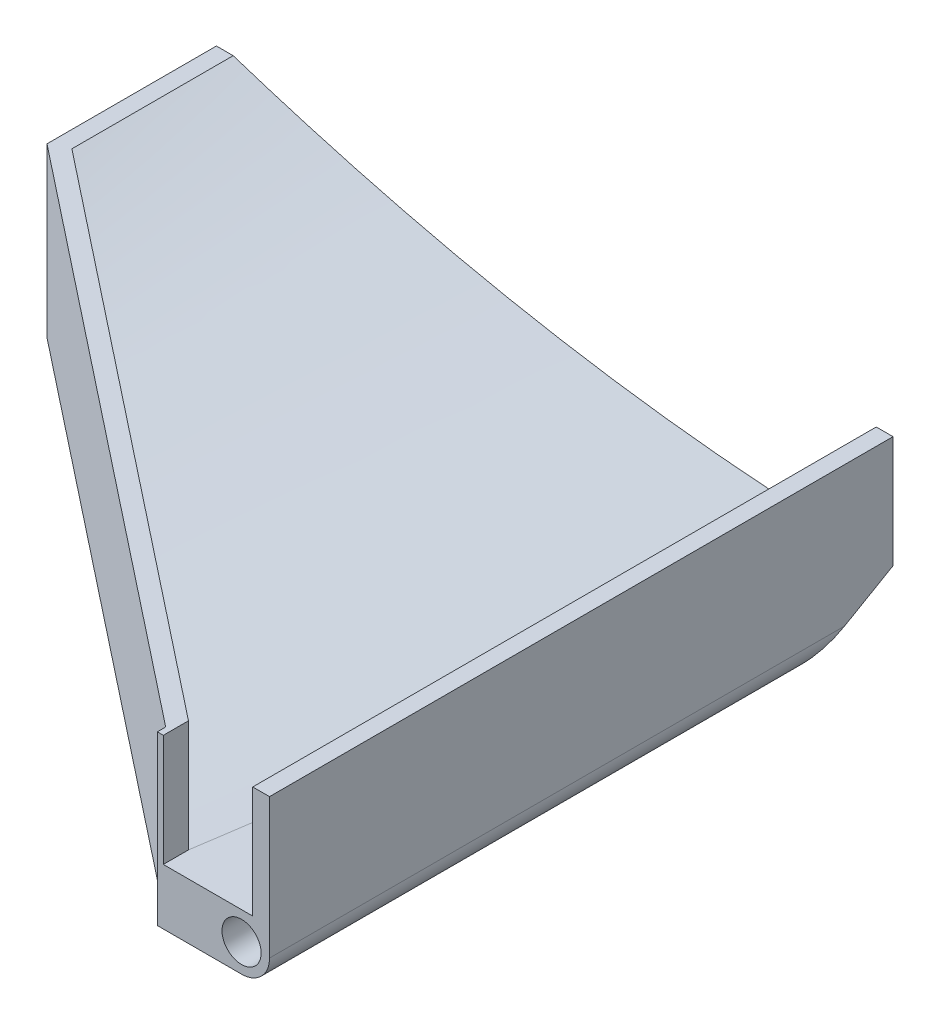
ISO-10303-21;
HEADER;
FILE_DESCRIPTION(('STEP AP214'),'2;1');
FILE_NAME('part.step','',(''),(''),'','','');
FILE_SCHEMA(('AUTOMOTIVE_DESIGN { 1 0 10303 214 1 1 1 1 }'));
ENDSEC;
DATA;
#1=APPLICATION_CONTEXT('core data for automotive mechanical design processes');
#2=APPLICATION_PROTOCOL_DEFINITION('international standard','automotive_design',2000,#1);
#3=PRODUCT_CONTEXT('',#1,'mechanical');
#4=PRODUCT('Part','Part','',(#3));
#5=PRODUCT_RELATED_PRODUCT_CATEGORY('part','',(#4));
#6=PRODUCT_DEFINITION_FORMATION('','',#4);
#7=PRODUCT_DEFINITION_CONTEXT('part definition',#1,'design');
#8=PRODUCT_DEFINITION('design','',#6,#7);
#9=PRODUCT_DEFINITION_SHAPE('','',#8);
#10=(LENGTH_UNIT() NAMED_UNIT(*) SI_UNIT(.MILLI.,.METRE.));
#11=(NAMED_UNIT(*) PLANE_ANGLE_UNIT() SI_UNIT($,.RADIAN.));
#12=(NAMED_UNIT(*) SI_UNIT($,.STERADIAN.) SOLID_ANGLE_UNIT());
#13=UNCERTAINTY_MEASURE_WITH_UNIT(LENGTH_MEASURE(1.E-05),#10,'distance_accuracy_value','');
#14=(GEOMETRIC_REPRESENTATION_CONTEXT(3) GLOBAL_UNCERTAINTY_ASSIGNED_CONTEXT((#13)) GLOBAL_UNIT_ASSIGNED_CONTEXT((#10,
#11,#12)) REPRESENTATION_CONTEXT('',''));
#15=CARTESIAN_POINT('',(0.,0.,0.));
#16=DIRECTION('',(0.,0.,1.));
#17=DIRECTION('',(1.,0.,0.));
#18=AXIS2_PLACEMENT_3D('',#15,#16,#17);
#19=CARTESIAN_POINT('',(-3.00000000000002,6.,0.));
#20=CARTESIAN_POINT('',(-41.9522982196753,6.,-0.488618188130201));
#21=CARTESIAN_POINT('',(-80.6967655810312,12.7497205836236,-0.813172243269495));
#22=CARTESIAN_POINT('',(-118.,26.,0.));
#23=CARTESIAN_POINT('',(-12.8333333333333,6.,0.));
#24=CARTESIAN_POINT('',(-48.5911871085642,6.,-0.488618188130201));
#25=CARTESIAN_POINT('',(-84.1412100254757,12.7497205836236,-0.813172243269495));
#26=CARTESIAN_POINT('',(-118.25,26.,0.));
#27=CARTESIAN_POINT('',(-32.5,6.,0.));
#28=CARTESIAN_POINT('',(-61.8689648863419,6.00000000000001,-0.488618188130201));
#29=CARTESIAN_POINT('',(-91.0300989143645,12.7497205836236,-0.813172243269495));
#30=CARTESIAN_POINT('',(-118.75,26.,0.));
#31=CARTESIAN_POINT('',(-62.,6.,0.));
#32=CARTESIAN_POINT('',(-81.7856315530087,6.00000000000001,-0.488618188130201));
#33=CARTESIAN_POINT('',(-101.363432247698,12.7497205836236,-0.813172243269495));
#34=CARTESIAN_POINT('',(-119.5,26.,0.));
#35=CARTESIAN_POINT('',(-91.5,6.,0.));
#36=CARTESIAN_POINT('',(-101.702298219675,6.,-0.488618188130201));
#37=CARTESIAN_POINT('',(-111.696765581031,12.7497205836235,-0.813172243269495));
#38=CARTESIAN_POINT('',(-120.25,26.,0.));
#39=CARTESIAN_POINT('',(-111.166666666667,6.,0.));
#40=CARTESIAN_POINT('',(-114.980075997453,6.,-0.488618188130201));
#41=CARTESIAN_POINT('',(-118.58565446992,12.7497205836236,-0.813172243269495));
#42=CARTESIAN_POINT('',(-120.75,26.,0.));
#43=CARTESIAN_POINT('',(-121.,6.,0.));
#44=CARTESIAN_POINT('',(-121.618964886342,6.00000000000001,-0.488618188130202));
#45=CARTESIAN_POINT('',(-122.030098914365,12.7497205836236,-0.813172243269496));
#46=CARTESIAN_POINT('',(-121.,26.,0.));
#47=B_SPLINE_SURFACE_WITH_KNOTS('',3,3,((#19,#20,#21,#22),(#23,#24,#25,#26),(#27,#28,#29,#30),
(#31,#32,#33,#34),(#35,#36,#37,#38),(#39,#40,#41,#42),(#43,#44,#45,#46)),.UNSPECIFIED.,.F.,.F.,
.F.,(4,1,1,1,4),(4,4),(0.367489557110488,0.411835272098321,0.456180987086155,0.500526702073988,
0.544872417061822),(0.,1.),.UNSPECIFIED.);
#48=CARTESIAN_POINT('',(-3.00000000000002,6.,0.));
#49=CARTESIAN_POINT('',(-12.8333333333333,6.,0.));
#50=CARTESIAN_POINT('',(-32.5,6.,0.));
#51=CARTESIAN_POINT('',(-62.,6.,0.));
#52=CARTESIAN_POINT('',(-91.5,6.,0.));
#53=CARTESIAN_POINT('',(-111.166666666667,6.,0.));
#54=CARTESIAN_POINT('',(-121.,6.,0.));
#55=B_SPLINE_CURVE_WITH_KNOTS('',3,(#48,#49,#50,#51,#52,#53,#54),.UNSPECIFIED.,.F.,.F.,(4,1,1,1,
4),(0.367489557110488,0.411835272098321,0.456180987086155,0.500526702073988,0.544872417061822),.UNSPECIFIED.);
#56=CARTESIAN_POINT('',(-118.,6.,0.));
#57=VERTEX_POINT('',#56);
#58=CARTESIAN_POINT('',(-121.,6.,0.));
#59=VERTEX_POINT('',#58);
#60=EDGE_CURVE('E218',#57,#59,#55,.T.);
#61=CARTESIAN_POINT('',(-121.,6.,0.));
#62=CARTESIAN_POINT('',(-121.,5.99998891587636,-0.00332590112745946));
#63=CARTESIAN_POINT('',(-121.,6.00031222120716,-0.0066383632839325));
#64=CARTESIAN_POINT('',(-121.,6.00153369790783,-0.0131101294695867));
#65=CARTESIAN_POINT('',(-121.,6.00242385912141,-0.0162709178854712));
#66=CARTESIAN_POINT('',(-121.,6.00500843172183,-0.0232732128294571));
#67=CARTESIAN_POINT('',(-121.,6.00685867760856,-0.0270559588460223));
#68=CARTESIAN_POINT('',(-121.,6.01113694663414,-0.0342959064968928));
#69=CARTESIAN_POINT('',(-121.,6.01356838657706,-0.0377510074984974));
#70=CARTESIAN_POINT('',(-121.,6.02092147479925,-0.0469765456128554));
#71=CARTESIAN_POINT('',(-121.,6.0262810471139,-0.0523923024326954));
#72=CARTESIAN_POINT('',(-121.,6.03766392035633,-0.0624533967850401));
#73=CARTESIAN_POINT('',(-121.,6.04368879452628,-0.0670968401760376));
#74=CARTESIAN_POINT('',(-121.,6.06035692219124,-0.0787973075150876));
#75=CARTESIAN_POINT('',(-121.,6.0713525377292,-0.0853460009575696));
#76=CARTESIAN_POINT('',(-121.,6.09387931521974,-0.0974619707159431));
#77=CARTESIAN_POINT('',(-121.,6.10541178435034,-0.10302667422696));
#78=CARTESIAN_POINT('',(-121.,6.12884858890875,-0.113493159118422));
#79=CARTESIAN_POINT('',(-121.,6.14075463379986,-0.118391087394583));
#80=CARTESIAN_POINT('',(-121.,6.16474697103231,-0.127663261585034));
#81=CARTESIAN_POINT('',(-121.,6.17683299997831,-0.13203820160657));
#82=CARTESIAN_POINT('',(-121.,6.21769457208593,-0.146093150008855));
#83=CARTESIAN_POINT('',(-121.,6.24677561041486,-0.154880711812414));
#84=CARTESIAN_POINT('',(-121.,6.30531202008821,-0.171120167604424));
#85=CARTESIAN_POINT('',(-121.,6.33476762598853,-0.17857117556728));
#86=CARTESIAN_POINT('',(-121.,6.42357907770008,-0.199566424530248));
#87=CARTESIAN_POINT('',(-121.,6.483262211154,-0.211717284218054));
#88=CARTESIAN_POINT('',(-121.,6.60292716300137,-0.233859066104148));
#89=CARTESIAN_POINT('',(-121.,6.66290851172591,-0.243852683763638));
#90=CARTESIAN_POINT('',(-121.,6.78302477380176,-0.262339437739009));
#91=CARTESIAN_POINT('',(-121.,6.84315940432491,-0.27083442016755));
#92=CARTESIAN_POINT('',(-121.,7.02282351039175,-0.294577228981029));
#93=CARTESIAN_POINT('',(-121.,7.14255941303959,-0.308242442790712));
#94=CARTESIAN_POINT('',(-121.,7.3823591817431,-0.332894322896109));
#95=CARTESIAN_POINT('',(-121.,7.50242318959565,-0.343879544050681));
#96=CARTESIAN_POINT('',(-121.,7.74256498801275,-0.363888738433381));
#97=CARTESIAN_POINT('',(-121.,7.86264258175814,-0.372915096224416));
#98=CARTESIAN_POINT('',(-121.,8.10287641244044,-0.389470030390875));
#99=CARTESIAN_POINT('',(-121.,8.22303263051341,-0.39699888603564));
#100=CARTESIAN_POINT('',(-121.,8.58350894668345,-0.41778807225705));
#101=CARTESIAN_POINT('',(-121.,8.823932106094,-0.429258428397179));
#102=CARTESIAN_POINT('',(-121.,9.30493156911595,-0.448814098441521));
#103=CARTESIAN_POINT('',(-121.,9.54550788527953,-0.456899085180803));
#104=CARTESIAN_POINT('',(-121.,10.0268418882747,-0.470439404676043));
#105=CARTESIAN_POINT('',(-121.,10.2675996079728,-0.475893549948317));
#106=CARTESIAN_POINT('',(-121.,10.7491442693904,-0.484657123665597));
#107=CARTESIAN_POINT('',(-121.,10.9899312098498,-0.48796662446666));
#108=CARTESIAN_POINT('',(-121.,11.7121650593692,-0.495202426311319));
#109=CARTESIAN_POINT('',(-121.,12.193639240793,-0.49643987078704));
#110=CARTESIAN_POINT('',(-121.,13.1565770294275,-0.493462067480753));
#111=CARTESIAN_POINT('',(-121.,13.6380406359019,-0.489246658091864));
#112=CARTESIAN_POINT('',(-121.,14.6008199917575,-0.476365372486955));
#113=CARTESIAN_POINT('',(-121.,15.0821357521442,-0.467700299133532));
#114=CARTESIAN_POINT('',(-121.,16.0446856188354,-0.446596667771749));
#115=CARTESIAN_POINT('',(-121.,16.5259197245703,-0.434158084439811));
#116=CARTESIAN_POINT('',(-121.,17.9692813716056,-0.391938789590593));
#117=CARTESIAN_POINT('',(-121.,18.9312663948751,-0.357251433631859));
#118=CARTESIAN_POINT('',(-121.,20.9113954147871,-0.275017837230902));
#119=CARTESIAN_POINT('',(-121.,21.9295123812978,-0.226834935524775));
#120=CARTESIAN_POINT('',(-121.,23.4562708722782,-0.147111561614738));
#121=CARTESIAN_POINT('',(-121.,23.9651104809872,-0.11929624467554));
#122=CARTESIAN_POINT('',(-121.,24.9826553715501,-0.0613464967096777));
#123=CARTESIAN_POINT('',(-121.,25.4913606540184,-0.0312120764815079));
#124=CARTESIAN_POINT('',(-121.,26.,0.));
#125=B_SPLINE_CURVE_WITH_KNOTS('',3,(#61,#62,#63,#64,#65,#66,#67,#68,#69,#70,#71,#72,#73,#74,
#75,#76,#77,#78,#79,#80,#81,#82,#83,#84,#85,#86,#87,#88,#89,#90,#91,#92,#93,#94,#95,#96,#97,#98,
#99,#100,#101,#102,#103,#104,#105,#106,#107,#108,#109,#110,#111,#112,#113,#114,#115,#116,#117,
#118,#119,#120,#121,#122,#123,#124),.UNSPECIFIED.,.F.,.F.,(4,2,2,2,2,2,2,2,2,2,2,2,2,2,2,2,2,2,
2,2,2,2,2,2,2,2,2,2,2,2,2,4),(0.,0.00994011196389003,0.0197427875816187,0.0323041550070358,
0.0449412693741195,0.0676710765043336,0.090455832987191,0.128748445734636,0.167139746222415,
0.205744249788375,0.244296935032231,0.335371455000891,0.426506128563776,0.609142604362729,
0.791549538812755,0.973730179644298,1.33521483334326,1.69689398286723,2.0581303523669,
2.41929929156253,3.14135016950364,3.86347081094949,4.58591709190193,5.30833899767904,
6.75271998498074,8.19714378055508,9.64130704711137,11.0854800054904,13.9732314481701,
17.0309433224769,18.5597367714475,20.0885231022931),.UNSPECIFIED.);
#126=CARTESIAN_POINT('',(-121.,26.,0.));
#127=VERTEX_POINT('',#126);
#128=EDGE_CURVE('E201',#59,#127,#125,.T.);
#129=DIRECTION('',(1.,0.,0.));
#130=VECTOR('',#129,1.);
#131=CARTESIAN_POINT('',(0.,26.,0.));
#132=LINE('',#131,#130);
#133=CARTESIAN_POINT('',(-118.,26.,0.));
#134=VERTEX_POINT('',#133);
#135=EDGE_CURVE('E319',#134,#127,#132,.F.);
#136=CARTESIAN_POINT('',(-3.00000000000002,6.,0.));
#137=CARTESIAN_POINT('',(-41.9522982196753,6.,-0.488618188130201));
#138=CARTESIAN_POINT('',(-80.6967655810312,12.7497205836236,-0.813172243269495));
#139=CARTESIAN_POINT('',(-118.,26.,0.));
#140=B_SPLINE_CURVE_WITH_KNOTS('',3,(#136,#137,#138,#139),.UNSPECIFIED.,.F.,.F.,(4,4),(0.,1.),.UNSPECIFIED.);
#141=CARTESIAN_POINT('',(-2.99999999999997,6.,-1.16528500815411E-13));
#142=VERTEX_POINT('',#141);
#143=EDGE_CURVE('E242',#142,#134,#140,.T.);
#144=DIRECTION('',(1.,0.,0.));
#145=VECTOR('',#144,1.);
#146=CARTESIAN_POINT('',(0.,6.,0.));
#147=LINE('',#146,#145);
#148=EDGE_CURVE('E226',#142,#57,#147,.F.);
#149=ORIENTED_EDGE('',*,*,#60,.T.);
#150=ORIENTED_EDGE('',*,*,#128,.T.);
#151=ORIENTED_EDGE('',*,*,#135,.F.);
#152=ORIENTED_EDGE('',*,*,#143,.F.);
#153=ORIENTED_EDGE('',*,*,#148,.T.);
#154=EDGE_LOOP('',(#149,#150,#151,#152,#153));
#155=FACE_BOUND('',#154,.T.);
#156=ADVANCED_FACE('F103',(#155),#47,.T.);
#157=CARTESIAN_POINT('',(0.,6.,0.));
#158=DIRECTION('',(0.,1.,0.));
#159=DIRECTION('',(0.,0.,1.));
#160=AXIS2_PLACEMENT_3D('',#157,#158,#159);
#161=PLANE('',#160);
#162=DIRECTION('',(0.,0.,1.));
#163=VECTOR('',#162,1.);
#164=CARTESIAN_POINT('',(-2.99999999999999,6.,107.));
#165=LINE('',#164,#163);
#166=CARTESIAN_POINT('',(-2.99999999999999,6.,111.5));
#167=VERTEX_POINT('',#166);
#168=EDGE_CURVE('E312',#142,#167,#165,.T.);
#169=ORIENTED_EDGE('',*,*,#168,.F.);
#170=DIRECTION('',(0.147851141619061,0.,-0.989009625798425));
#171=VECTOR('',#170,1.);
#172=CARTESIAN_POINT('',(-2.99999999999999,6.,0.));
#173=LINE('',#172,#171);
#174=CARTESIAN_POINT('',(-18.9958727807811,6.,107.));
#175=VERTEX_POINT('',#174);
#176=EDGE_CURVE('E396',#175,#142,#173,.T.);
#177=ORIENTED_EDGE('',*,*,#176,.F.);
#178=DIRECTION('',(0.,0.,-1.));
#179=VECTOR('',#178,1.);
#180=CARTESIAN_POINT('',(-18.9958727807811,6.,107.));
#181=LINE('',#180,#179);
#182=CARTESIAN_POINT('',(-18.9958727807811,6.,111.5));
#183=VERTEX_POINT('',#182);
#184=EDGE_CURVE('E315',#183,#175,#181,.T.);
#185=ORIENTED_EDGE('',*,*,#184,.F.);
#186=DIRECTION('',(-1.,0.,0.));
#187=VECTOR('',#186,1.);
#188=CARTESIAN_POINT('',(-2.99999999999999,6.,111.5));
#189=LINE('',#188,#187);
#190=EDGE_CURVE('E371',#167,#183,#189,.T.);
#191=ORIENTED_EDGE('',*,*,#190,.F.);
#192=EDGE_LOOP('',(#169,#177,#185,#191));
#193=FACE_BOUND('',#192,.T.);
#194=ADVANCED_FACE('F254',(#193),#161,.T.);
#195=CARTESIAN_POINT('',(0.,-4.,0.));
#196=DIRECTION('',(1.,0.,0.));
#197=DIRECTION('',(0.,0.,-1.));
#198=AXIS2_PLACEMENT_3D('',#195,#196,#197);
#199=PLANE('',#198);
#200=DIRECTION('',(0.,1.,0.));
#201=VECTOR('',#200,1.);
#202=CARTESIAN_POINT('',(0.,-4.,111.5));
#203=LINE('',#202,#201);
#204=CARTESIAN_POINT('',(0.,0.999999999999998,111.5));
#205=VERTEX_POINT('',#204);
#206=CARTESIAN_POINT('',(0.,26.,111.5));
#207=VERTEX_POINT('',#206);
#208=EDGE_CURVE('E383',#205,#207,#203,.T.);
#209=ORIENTED_EDGE('',*,*,#208,.F.);
#210=DIRECTION('',(0.,0.,-1.));
#211=VECTOR('',#210,1.);
#212=CARTESIAN_POINT('',(0.,1.,17.3205080756889));
#213=LINE('',#212,#211);
#214=CARTESIAN_POINT('',(0.,0.999999999999999,8.66025403784444));
#215=VERTEX_POINT('',#214);
#216=EDGE_CURVE('E213',#205,#215,#213,.T.);
#217=ORIENTED_EDGE('',*,*,#216,.T.);
#218=DIRECTION('',(0.,0.499999999999998,-0.86602540378444));
#219=VECTOR('',#218,1.);
#220=CARTESIAN_POINT('',(0.,3.50000000000002,4.33012701892218));
#221=LINE('',#220,#219);
#222=CARTESIAN_POINT('',(0.,6.,0.));
#223=VERTEX_POINT('',#222);
#224=EDGE_CURVE('E345',#215,#223,#221,.T.);
#225=ORIENTED_EDGE('',*,*,#224,.T.);
#226=DIRECTION('',(0.,1.,0.));
#227=VECTOR('',#226,1.);
#228=CARTESIAN_POINT('',(0.,-4.,0.));
#229=LINE('',#228,#227);
#230=CARTESIAN_POINT('',(0.,26.,0.));
#231=VERTEX_POINT('',#230);
#232=EDGE_CURVE('E287',#223,#231,#229,.T.);
#233=ORIENTED_EDGE('',*,*,#232,.T.);
#234=DIRECTION('',(0.,0.,-1.));
#235=VECTOR('',#234,1.);
#236=CARTESIAN_POINT('',(0.,26.,110.));
#237=LINE('',#236,#235);
#238=EDGE_CURVE('E308',#207,#231,#237,.T.);
#239=ORIENTED_EDGE('',*,*,#238,.F.);
#240=EDGE_LOOP('',(#209,#217,#225,#233,#239));
#241=FACE_BOUND('',#240,.T.);
#242=ADVANCED_FACE('F436',(#241),#199,.T.);
#243=CARTESIAN_POINT('',(-121.,-4.,0.));
#244=DIRECTION('',(-1.,0.,0.));
#245=DIRECTION('',(0.,0.,1.));
#246=AXIS2_PLACEMENT_3D('',#243,#244,#245);
#247=PLANE('',#246);
#248=DIRECTION('',(0.,1.,0.));
#249=VECTOR('',#248,1.);
#250=CARTESIAN_POINT('',(-121.,-4.,30.298554482171));
#251=LINE('',#250,#249);
#252=CARTESIAN_POINT('',(-121.,-4.,30.298554482171));
#253=VERTEX_POINT('',#252);
#254=CARTESIAN_POINT('',(-121.,26.,30.298554482171));
#255=VERTEX_POINT('',#254);
#256=EDGE_CURVE('E284',#253,#255,#251,.T.);
#257=ORIENTED_EDGE('',*,*,#256,.T.);
#258=DIRECTION('',(0.,0.,1.));
#259=VECTOR('',#258,1.);
#260=CARTESIAN_POINT('',(-121.,26.,0.));
#261=LINE('',#260,#259);
#262=EDGE_CURVE('E207',#127,#255,#261,.T.);
#263=ORIENTED_EDGE('',*,*,#262,.F.);
#264=ORIENTED_EDGE('',*,*,#128,.F.);
#265=DIRECTION('',(0.,-0.499999999999998,0.86602540378444));
#266=VECTOR('',#265,1.);
#267=CARTESIAN_POINT('',(-121.,3.50000000000002,4.33012701892218));
#268=LINE('',#267,#266);
#269=CARTESIAN_POINT('',(-121.,-4.,17.3205080756889));
#270=VERTEX_POINT('',#269);
#271=EDGE_CURVE('E205',#59,#270,#268,.T.);
#272=ORIENTED_EDGE('',*,*,#271,.T.);
#273=DIRECTION('',(0.,0.,1.));
#274=VECTOR('',#273,1.);
#275=CARTESIAN_POINT('',(-121.,-4.,0.));
#276=LINE('',#275,#274);
#277=EDGE_CURVE('E293',#270,#253,#276,.T.);
#278=ORIENTED_EDGE('',*,*,#277,.T.);
#279=EDGE_LOOP('',(#257,#263,#264,#272,#278));
#280=FACE_BOUND('',#279,.T.);
#281=ADVANCED_FACE('F204',(#280),#247,.T.);
#282=CARTESIAN_POINT('',(0.,-4.,0.));
#283=DIRECTION('',(0.,0.,-1.));
#284=DIRECTION('',(-1.,0.,0.));
#285=AXIS2_PLACEMENT_3D('',#282,#283,#284);
#286=PLANE('',#285);
#287=ORIENTED_EDGE('',*,*,#232,.F.);
#288=DIRECTION('',(-1.,0.,0.));
#289=VECTOR('',#288,1.);
#290=CARTESIAN_POINT('',(0.,6.,0.));
#291=LINE('',#290,#289);
#292=EDGE_CURVE('E341',#223,#142,#291,.T.);
#293=ORIENTED_EDGE('',*,*,#292,.T.);
#294=DIRECTION('',(0.,-1.,0.));
#295=VECTOR('',#294,1.);
#296=CARTESIAN_POINT('',(-3.,26.,0.));
#297=LINE('',#296,#295);
#298=CARTESIAN_POINT('',(-3.,26.,0.));
#299=VERTEX_POINT('',#298);
#300=EDGE_CURVE('E298',#299,#142,#297,.T.);
#301=ORIENTED_EDGE('',*,*,#300,.F.);
#302=DIRECTION('',(-1.,0.,0.));
#303=VECTOR('',#302,1.);
#304=CARTESIAN_POINT('',(0.,26.,0.));
#305=LINE('',#304,#303);
#306=EDGE_CURVE('E305',#231,#299,#305,.T.);
#307=ORIENTED_EDGE('',*,*,#306,.F.);
#308=EDGE_LOOP('',(#287,#293,#301,#307));
#309=FACE_BOUND('',#308,.T.);
#310=ADVANCED_FACE('F440',(#309),#286,.T.);
#311=CARTESIAN_POINT('',(0.,-4.,0.));
#312=DIRECTION('',(0.,1.,0.));
#313=DIRECTION('',(0.,0.,1.));
#314=AXIS2_PLACEMENT_3D('',#311,#312,#313);
#315=PLANE('',#314);
#316=DIRECTION('',(-1.,0.,0.));
#317=VECTOR('',#316,1.);
#318=CARTESIAN_POINT('',(0.,-4.,17.3205080756889));
#319=LINE('',#318,#317);
#320=CARTESIAN_POINT('',(-5.,-4.,17.3205080756889));
#321=VERTEX_POINT('',#320);
#322=EDGE_CURVE('E221',#321,#270,#319,.T.);
#323=ORIENTED_EDGE('',*,*,#322,.F.);
#324=DIRECTION('',(0.,0.,-1.));
#325=VECTOR('',#324,1.);
#326=CARTESIAN_POINT('',(-4.99999999999999,-4.,111.5));
#327=LINE('',#326,#325);
#328=CARTESIAN_POINT('',(-4.99999999999999,-4.,111.5));
#329=VERTEX_POINT('',#328);
#330=EDGE_CURVE('E112',#321,#329,#327,.F.);
#331=ORIENTED_EDGE('',*,*,#330,.T.);
#332=DIRECTION('',(1.,0.,0.));
#333=VECTOR('',#332,1.);
#334=CARTESIAN_POINT('',(-20.07,-4.,111.5));
#335=LINE('',#334,#333);
#336=CARTESIAN_POINT('',(-20.07,-4.,111.5));
#337=VERTEX_POINT('',#336);
#338=EDGE_CURVE('E386',#337,#329,#335,.T.);
#339=ORIENTED_EDGE('',*,*,#338,.F.);
#340=DIRECTION('',(0.,0.,-1.));
#341=VECTOR('',#340,1.);
#342=CARTESIAN_POINT('',(-20.07,-4.,111.5));
#343=LINE('',#342,#341);
#344=CARTESIAN_POINT('',(-20.07,-4.,110.));
#345=VERTEX_POINT('',#344);
#346=EDGE_CURVE('E357',#337,#345,#343,.T.);
#347=ORIENTED_EDGE('',*,*,#346,.T.);
#348=DIRECTION('',(0.784807629816056,0.,0.619739448625392));
#349=VECTOR('',#348,1.);
#350=CARTESIAN_POINT('',(-121.,-4.,30.298554482171));
#351=LINE('',#350,#349);
#352=EDGE_CURVE('E290',#253,#345,#351,.T.);
#353=ORIENTED_EDGE('',*,*,#352,.F.);
#354=ORIENTED_EDGE('',*,*,#277,.F.);
#355=EDGE_LOOP('',(#323,#331,#339,#347,#353,#354));
#356=FACE_BOUND('',#355,.T.);
#357=ADVANCED_FACE('F432',(#356),#315,.F.);
#358=CARTESIAN_POINT('',(-5.,1.,110.));
#359=DIRECTION('',(0.,0.,-1.));
#360=DIRECTION('',(-1.,0.,0.));
#361=AXIS2_PLACEMENT_3D('',#358,#359,#360);
#362=CYLINDRICAL_SURFACE('',#361,3.5);
#363=CARTESIAN_POINT('',(-5.,1.,8.66025403784443));
#364=DIRECTION('',(0.,-0.86602540378444,-0.499999999999998));
#365=DIRECTION('',(0.,0.499999999999998,-0.86602540378444));
#366=AXIS2_PLACEMENT_3D('',#363,#364,#365);
#367=ELLIPSE('',#366,7.00000000000003,3.5);
#368=CARTESIAN_POINT('',(-5.,4.5,2.59807621135332));
#369=VERTEX_POINT('',#368);
#370=EDGE_CURVE('E228',#369,#369,#367,.F.);
#371=ORIENTED_EDGE('',*,*,#370,.F.);
#372=EDGE_LOOP('',(#371));
#373=FACE_BOUND('',#372,.T.);
#374=CARTESIAN_POINT('',(-5.,1.,111.5));
#375=DIRECTION('',(0.,0.,1.));
#376=DIRECTION('',(1.,0.,0.));
#377=AXIS2_PLACEMENT_3D('',#374,#375,#376);
#378=CIRCLE('',#377,3.5);
#379=CARTESIAN_POINT('',(-1.5,1.,111.5));
#380=VERTEX_POINT('',#379);
#381=EDGE_CURVE('E236',#380,#380,#378,.T.);
#382=ORIENTED_EDGE('',*,*,#381,.T.);
#383=EDGE_LOOP('',(#382));
#384=FACE_BOUND('',#383,.T.);
#385=ADVANCED_FACE('F428',(#373,#384),#362,.F.);
#386=CARTESIAN_POINT('',(-121.,-4.,30.298554482171));
#387=DIRECTION('',(-0.619739448625392,0.,0.784807629816056));
#388=DIRECTION('',(0.784807629816056,0.,0.619739448625392));
#389=AXIS2_PLACEMENT_3D('',#386,#387,#388);
#390=PLANE('',#389);
#391=DIRECTION('',(0.,1.,0.));
#392=VECTOR('',#391,1.);
#393=CARTESIAN_POINT('',(-20.07,-4.,110.));
#394=LINE('',#393,#392);
#395=CARTESIAN_POINT('',(-20.07,26.,110.));
#396=VERTEX_POINT('',#395);
#397=EDGE_CURVE('E214',#345,#396,#394,.T.);
#398=ORIENTED_EDGE('',*,*,#397,.T.);
#399=DIRECTION('',(0.784807629816056,0.,0.619739448625392));
#400=VECTOR('',#399,1.);
#401=CARTESIAN_POINT('',(-121.,26.,30.298554482171));
#402=LINE('',#401,#400);
#403=EDGE_CURVE('E324',#255,#396,#402,.T.);
#404=ORIENTED_EDGE('',*,*,#403,.F.);
#405=ORIENTED_EDGE('',*,*,#256,.F.);
#406=ORIENTED_EDGE('',*,*,#352,.T.);
#407=EDGE_LOOP('',(#398,#404,#405,#406));
#408=FACE_BOUND('',#407,.T.);
#409=ADVANCED_FACE('F431',(#408),#390,.T.);
#410=CARTESIAN_POINT('',(-18.9958727807811,26.,107.));
#411=DIRECTION('',(-1.,0.,0.));
#412=DIRECTION('',(0.,0.,1.));
#413=AXIS2_PLACEMENT_3D('',#410,#411,#412);
#414=PLANE('',#413);
#415=ORIENTED_EDGE('',*,*,#184,.T.);
#416=DIRECTION('',(0.,-1.,0.));
#417=VECTOR('',#416,1.);
#418=CARTESIAN_POINT('',(-18.9958727807811,26.,107.));
#419=LINE('',#418,#417);
#420=CARTESIAN_POINT('',(-18.9958727807811,26.,107.));
#421=VERTEX_POINT('',#420);
#422=EDGE_CURVE('E338',#421,#175,#419,.T.);
#423=ORIENTED_EDGE('',*,*,#422,.F.);
#424=DIRECTION('',(0.,0.,-1.));
#425=VECTOR('',#424,1.);
#426=CARTESIAN_POINT('',(-18.9958727807811,26.,107.));
#427=LINE('',#426,#425);
#428=CARTESIAN_POINT('',(-18.9958727807811,26.,111.5));
#429=VERTEX_POINT('',#428);
#430=EDGE_CURVE('E328',#429,#421,#427,.T.);
#431=ORIENTED_EDGE('',*,*,#430,.F.);
#432=DIRECTION('',(0.,1.,0.));
#433=VECTOR('',#432,1.);
#434=CARTESIAN_POINT('',(-18.9958727807811,6.,111.5));
#435=LINE('',#434,#433);
#436=EDGE_CURVE('E367',#183,#429,#435,.T.);
#437=ORIENTED_EDGE('',*,*,#436,.F.);
#438=EDGE_LOOP('',(#415,#423,#431,#437));
#439=FACE_BOUND('',#438,.T.);
#440=ADVANCED_FACE('F443',(#439),#414,.F.);
#441=CARTESIAN_POINT('',(-18.9958727807811,26.,107.));
#442=DIRECTION('',(-0.619614367374536,0.,0.784906386611201));
#443=DIRECTION('',(0.784906386611202,0.,0.619614367374537));
#444=AXIS2_PLACEMENT_3D('',#441,#442,#443);
#445=PLANE('',#444);
#446=ORIENTED_EDGE('',*,*,#422,.T.);
#447=CARTESIAN_POINT('',(-18.9958727807811,6.,107.));
#448=CARTESIAN_POINT('',(-52.6162134068627,6.,80.4597062232024));
#449=CARTESIAN_POINT('',(-86.0287231746249,12.7497205836236,54.0834765793958));
#450=CARTESIAN_POINT('',(-118.,26.,28.8449732339979));
#451=B_SPLINE_CURVE_WITH_KNOTS('',3,(#447,#448,#449,#450),.UNSPECIFIED.,.F.,.F.,(4,4),(0.,1.),.UNSPECIFIED.);
#452=CARTESIAN_POINT('',(-118.,26.,28.8449732339979));
#453=VERTEX_POINT('',#452);
#454=EDGE_CURVE('E391',#175,#453,#451,.T.);
#455=ORIENTED_EDGE('',*,*,#454,.T.);
#456=DIRECTION('',(-0.784906386611201,0.,-0.619614367374536));
#457=VECTOR('',#456,1.);
#458=CARTESIAN_POINT('',(-18.9958727807811,26.,107.));
#459=LINE('',#458,#457);
#460=EDGE_CURVE('E331',#421,#453,#459,.T.);
#461=ORIENTED_EDGE('',*,*,#460,.F.);
#462=EDGE_LOOP('',(#446,#455,#461));
#463=FACE_BOUND('',#462,.T.);
#464=ADVANCED_FACE('F425',(#463),#445,.F.);
#465=CARTESIAN_POINT('',(0.,26.,0.));
#466=DIRECTION('',(0.,1.,0.));
#467=DIRECTION('',(0.,0.,1.));
#468=AXIS2_PLACEMENT_3D('',#465,#466,#467);
#469=PLANE('',#468);
#470=ORIENTED_EDGE('',*,*,#460,.T.);
#471=CARTESIAN_POINT('',(-118.,26.,0.));
#472=CARTESIAN_POINT('',(-118.,26.,2.40374776949983));
#473=CARTESIAN_POINT('',(-118.,26.,7.2112433084995));
#474=CARTESIAN_POINT('',(-118.,26.,14.4224866169989));
#475=CARTESIAN_POINT('',(-118.,26.,21.6337299254984));
#476=CARTESIAN_POINT('',(-118.,26.,26.4412254644981));
#477=CARTESIAN_POINT('',(-118.,26.,28.8449732339979));
#478=B_SPLINE_CURVE_WITH_KNOTS('',3,(#471,#472,#473,#474,#475,#476,#477),.UNSPECIFIED.,.F.,.F.,
(4,1,1,1,4),(0.,0.091872389277622,0.183744778555244,0.275617167832866,0.367489557110488),.UNSPECIFIED.);
#479=EDGE_CURVE('E335',#453,#134,#478,.F.);
#480=ORIENTED_EDGE('',*,*,#479,.T.);
#481=ORIENTED_EDGE('',*,*,#135,.T.);
#482=ORIENTED_EDGE('',*,*,#262,.T.);
#483=ORIENTED_EDGE('',*,*,#403,.T.);
#484=DIRECTION('',(0.,0.,-1.));
#485=VECTOR('',#484,1.);
#486=CARTESIAN_POINT('',(-20.07,26.,111.5));
#487=LINE('',#486,#485);
#488=CARTESIAN_POINT('',(-20.07,26.,111.5));
#489=VERTEX_POINT('',#488);
#490=EDGE_CURVE('E353',#489,#396,#487,.T.);
#491=ORIENTED_EDGE('',*,*,#490,.F.);
#492=DIRECTION('',(-1.,0.,0.));
#493=VECTOR('',#492,1.);
#494=CARTESIAN_POINT('',(-18.9958727807811,26.,111.5));
#495=LINE('',#494,#493);
#496=EDGE_CURVE('E364',#429,#489,#495,.T.);
#497=ORIENTED_EDGE('',*,*,#496,.F.);
#498=ORIENTED_EDGE('',*,*,#430,.T.);
#499=EDGE_LOOP('',(#470,#480,#481,#482,#483,#491,#497,#498));
#500=FACE_BOUND('',#499,.T.);
#501=ADVANCED_FACE('F414',(#500),#469,.T.);
#502=CARTESIAN_POINT('',(-2.99999999999999,26.,107.));
#503=DIRECTION('',(1.,0.,0.));
#504=DIRECTION('',(0.,0.,-1.));
#505=AXIS2_PLACEMENT_3D('',#502,#503,#504);
#506=PLANE('',#505);
#507=ORIENTED_EDGE('',*,*,#168,.T.);
#508=DIRECTION('',(0.,-1.,0.));
#509=VECTOR('',#508,1.);
#510=CARTESIAN_POINT('',(-2.99999999999999,26.,111.5));
#511=LINE('',#510,#509);
#512=CARTESIAN_POINT('',(-2.99999999999999,26.,111.5));
#513=VERTEX_POINT('',#512);
#514=EDGE_CURVE('E375',#513,#167,#511,.T.);
#515=ORIENTED_EDGE('',*,*,#514,.F.);
#516=DIRECTION('',(0.,0.,1.));
#517=VECTOR('',#516,1.);
#518=CARTESIAN_POINT('',(-3.,26.,3.));
#519=LINE('',#518,#517);
#520=EDGE_CURVE('E302',#299,#513,#519,.T.);
#521=ORIENTED_EDGE('',*,*,#520,.F.);
#522=ORIENTED_EDGE('',*,*,#300,.T.);
#523=EDGE_LOOP('',(#507,#515,#521,#522));
#524=FACE_BOUND('',#523,.T.);
#525=ADVANCED_FACE('F424',(#524),#506,.F.);
#526=CARTESIAN_POINT('',(0.,26.,0.));
#527=DIRECTION('',(0.,1.,0.));
#528=DIRECTION('',(0.,0.,1.));
#529=AXIS2_PLACEMENT_3D('',#526,#527,#528);
#530=PLANE('',#529);
#531=ORIENTED_EDGE('',*,*,#238,.T.);
#532=ORIENTED_EDGE('',*,*,#306,.T.);
#533=ORIENTED_EDGE('',*,*,#520,.T.);
#534=DIRECTION('',(-1.,0.,0.));
#535=VECTOR('',#534,1.);
#536=CARTESIAN_POINT('',(0.,26.,111.5));
#537=LINE('',#536,#535);
#538=EDGE_CURVE('E379',#207,#513,#537,.T.);
#539=ORIENTED_EDGE('',*,*,#538,.F.);
#540=EDGE_LOOP('',(#531,#532,#533,#539));
#541=FACE_BOUND('',#540,.T.);
#542=ADVANCED_FACE('F500',(#541),#530,.T.);
#543=CARTESIAN_POINT('',(0.,4.50000000000001,2.59807621135331));
#544=DIRECTION('',(0.,-0.86602540378444,-0.499999999999998));
#545=DIRECTION('',(0.,0.499999999999998,-0.86602540378444));
#546=AXIS2_PLACEMENT_3D('',#543,#544,#545);
#547=PLANE('',#546);
#548=ORIENTED_EDGE('',*,*,#224,.F.);
#549=CARTESIAN_POINT('',(-5.,1.,8.66025403784443));
#550=DIRECTION('',(0.,-0.86602540378444,-0.499999999999998));
#551=DIRECTION('',(0.,-0.499999999999998,0.86602540378444));
#552=AXIS2_PLACEMENT_3D('',#549,#550,#551);
#553=ELLIPSE('',#552,10.,5.);
#554=EDGE_CURVE('E126',#215,#321,#553,.T.);
#555=ORIENTED_EDGE('',*,*,#554,.T.);
#556=ORIENTED_EDGE('',*,*,#322,.T.);
#557=ORIENTED_EDGE('',*,*,#271,.F.);
#558=ORIENTED_EDGE('',*,*,#60,.F.);
#559=ORIENTED_EDGE('',*,*,#148,.F.);
#560=ORIENTED_EDGE('',*,*,#292,.F.);
#561=EDGE_LOOP('',(#548,#555,#556,#557,#558,#559,#560));
#562=FACE_BOUND('',#561,.T.);
#563=ORIENTED_EDGE('',*,*,#370,.T.);
#564=EDGE_LOOP('',(#563));
#565=FACE_BOUND('',#564,.T.);
#566=ADVANCED_FACE('F216',(#562,#565),#547,.T.);
#567=CARTESIAN_POINT('',(0.,0.,111.5));
#568=DIRECTION('',(0.,0.,1.));
#569=DIRECTION('',(1.,0.,0.));
#570=AXIS2_PLACEMENT_3D('',#567,#568,#569);
#571=PLANE('',#570);
#572=ORIENTED_EDGE('',*,*,#338,.T.);
#573=CARTESIAN_POINT('',(-4.99999999999999,1.,111.5));
#574=DIRECTION('',(0.,0.,1.));
#575=DIRECTION('',(1.,0.,0.));
#576=AXIS2_PLACEMENT_3D('',#573,#574,#575);
#577=CIRCLE('',#576,5.);
#578=EDGE_CURVE('E13',#329,#205,#577,.T.);
#579=ORIENTED_EDGE('',*,*,#578,.T.);
#580=ORIENTED_EDGE('',*,*,#208,.T.);
#581=ORIENTED_EDGE('',*,*,#538,.T.);
#582=ORIENTED_EDGE('',*,*,#514,.T.);
#583=ORIENTED_EDGE('',*,*,#190,.T.);
#584=ORIENTED_EDGE('',*,*,#436,.T.);
#585=ORIENTED_EDGE('',*,*,#496,.T.);
#586=DIRECTION('',(0.,-1.,0.));
#587=VECTOR('',#586,1.);
#588=CARTESIAN_POINT('',(-20.07,26.,111.5));
#589=LINE('',#588,#587);
#590=EDGE_CURVE('E361',#489,#337,#589,.T.);
#591=ORIENTED_EDGE('',*,*,#590,.T.);
#592=EDGE_LOOP('',(#572,#579,#580,#581,#582,#583,#584,#585,#591));
#593=FACE_BOUND('',#592,.T.);
#594=ORIENTED_EDGE('',*,*,#381,.F.);
#595=EDGE_LOOP('',(#594));
#596=FACE_BOUND('',#595,.T.);
#597=ADVANCED_FACE('F260',(#593,#596),#571,.T.);
#598=CARTESIAN_POINT('',(-20.07,26.,111.5));
#599=DIRECTION('',(1.,0.,0.));
#600=DIRECTION('',(0.,0.,-1.));
#601=AXIS2_PLACEMENT_3D('',#598,#599,#600);
#602=PLANE('',#601);
#603=ORIENTED_EDGE('',*,*,#397,.F.);
#604=ORIENTED_EDGE('',*,*,#346,.F.);
#605=ORIENTED_EDGE('',*,*,#590,.F.);
#606=ORIENTED_EDGE('',*,*,#490,.T.);
#607=EDGE_LOOP('',(#603,#604,#605,#606));
#608=FACE_BOUND('',#607,.T.);
#609=ADVANCED_FACE('F466',(#608),#602,.F.);
#610=CARTESIAN_POINT('',(-18.9958727807811,6.,107.));
#611=CARTESIAN_POINT('',(-52.6162134068627,6.,80.4597062232024));
#612=CARTESIAN_POINT('',(-86.0287231746249,12.7497205836236,54.0834765793958));
#613=CARTESIAN_POINT('',(-118.,26.,28.8449732339979));
#614=CARTESIAN_POINT('',(-17.6628833823827,6.,98.0833333333333));
#615=CARTESIAN_POINT('',(-51.7275538079304,6.,73.714012522258));
#616=CARTESIAN_POINT('',(-85.5843933751588,12.7497205836236,49.5087558441737));
#617=CARTESIAN_POINT('',(-118.,26.,26.4412254644981));
#618=CARTESIAN_POINT('',(-14.9969045855858,6.,80.25));
#619=CARTESIAN_POINT('',(-49.9502346100659,6.,60.2226251203693));
#620=CARTESIAN_POINT('',(-84.6957337762265,12.7497205836236,40.3593143737295));
#621=CARTESIAN_POINT('',(-118.,26.,21.6337299254984));
#622=CARTESIAN_POINT('',(-10.9979363903905,6.,53.5));
#623=CARTESIAN_POINT('',(-47.284255813269,6.00000000000001,39.9855440175361));
#624=CARTESIAN_POINT('',(-83.3627443778281,12.7497205836236,26.6351521680631));
#625=CARTESIAN_POINT('',(-118.,26.,14.4224866169989));
#626=CARTESIAN_POINT('',(-6.99896819519527,6.,26.75));
#627=CARTESIAN_POINT('',(-44.6182770164722,6.,19.748462914703));
#628=CARTESIAN_POINT('',(-82.0297549794297,12.7497205836235,12.9109899623968));
#629=CARTESIAN_POINT('',(-118.,26.,7.2112433084995));
#630=CARTESIAN_POINT('',(-4.33298939839842,6.,8.91666666666667));
#631=CARTESIAN_POINT('',(-42.8409578186076,6.,6.25707551281419));
#632=CARTESIAN_POINT('',(-81.1410953804974,12.7497205836236,3.76154849195261));
#633=CARTESIAN_POINT('',(-118.,26.,2.40374776949983));
#634=CARTESIAN_POINT('',(-3.00000000000002,6.,0.));
#635=CARTESIAN_POINT('',(-41.9522982196753,6.,-0.488618188130201));
#636=CARTESIAN_POINT('',(-80.6967655810312,12.7497205836236,-0.813172243269495));
#637=CARTESIAN_POINT('',(-118.,26.,0.));
#638=B_SPLINE_SURFACE_WITH_KNOTS('',3,3,((#610,#611,#612,#613),(#614,#615,#616,#617),(#618,#619,
#620,#621),(#622,#623,#624,#625),(#626,#627,#628,#629),(#630,#631,#632,#633),(#634,#635,#636,
#637)),.UNSPECIFIED.,.F.,.F.,.F.,(4,1,1,1,4),(4,4),(0.,0.0918723892776219,0.183744778555244,
0.275617167832866,0.367489557110488),(0.,1.),.UNSPECIFIED.);
#639=ORIENTED_EDGE('',*,*,#176,.T.);
#640=ORIENTED_EDGE('',*,*,#143,.T.);
#641=ORIENTED_EDGE('',*,*,#479,.F.);
#642=ORIENTED_EDGE('',*,*,#454,.F.);
#643=EDGE_LOOP('',(#639,#640,#641,#642));
#644=FACE_BOUND('',#643,.T.);
#645=ADVANCED_FACE('F255',(#644),#638,.T.);
#646=CARTESIAN_POINT('',(-5.,1.,0.));
#647=DIRECTION('',(0.,0.,1.));
#648=DIRECTION('',(1.,0.,0.));
#649=AXIS2_PLACEMENT_3D('',#646,#647,#648);
#650=CYLINDRICAL_SURFACE('',#649,5.);
#651=ORIENTED_EDGE('',*,*,#578,.F.);
#652=ORIENTED_EDGE('',*,*,#330,.F.);
#653=ORIENTED_EDGE('',*,*,#554,.F.);
#654=ORIENTED_EDGE('',*,*,#216,.F.);
#655=EDGE_LOOP('',(#651,#652,#653,#654));
#656=FACE_BOUND('',#655,.T.);
#657=ADVANCED_FACE('F105',(#656),#650,.T.);
#658=CLOSED_SHELL('',(#156,#194,#242,#281,#310,#357,#385,#409,#440,#464,#501,#525,#542,#566,
#597,#609,#645,#657));
#659=MANIFOLD_SOLID_BREP('B2',#658);
#660=ADVANCED_BREP_SHAPE_REPRESENTATION('',(#18,#659),#14);
#661=SHAPE_DEFINITION_REPRESENTATION(#9,#660);
ENDSEC;
END-ISO-10303-21;
